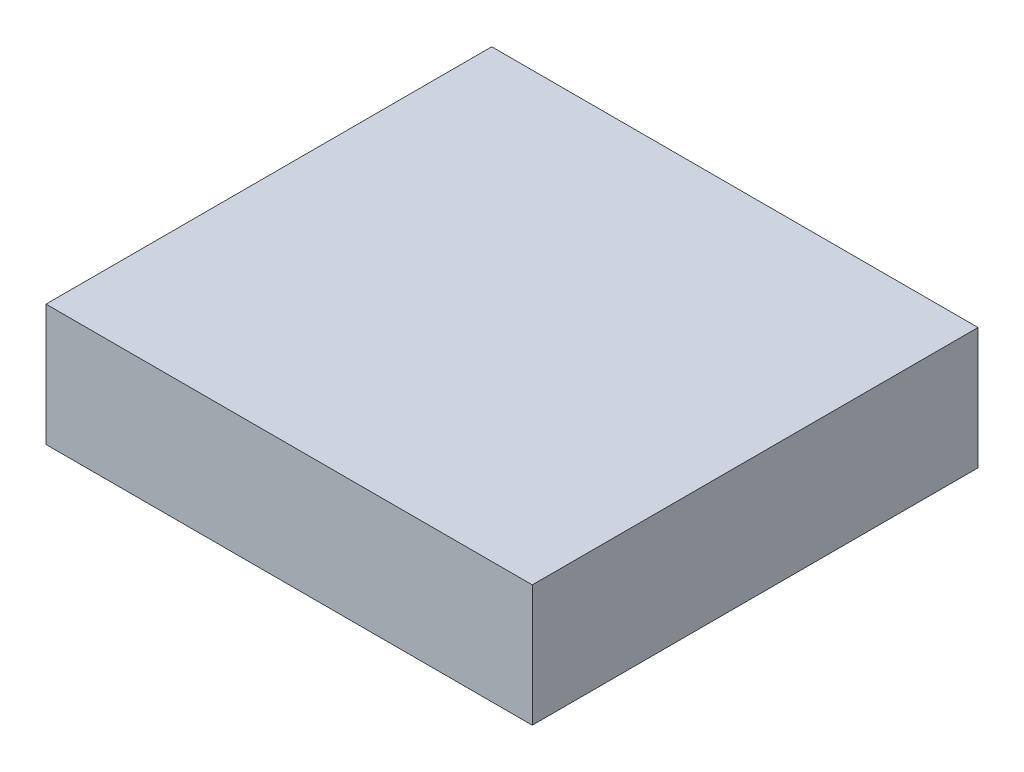
ISO-10303-21;
HEADER;
FILE_DESCRIPTION(('STEP AP214'),'2;1');
FILE_NAME('part.step','',(''),(''),'','','');
FILE_SCHEMA(('AUTOMOTIVE_DESIGN { 1 0 10303 214 1 1 1 1 }'));
ENDSEC;
DATA;
#1=APPLICATION_CONTEXT('core data for automotive mechanical design processes');
#2=APPLICATION_PROTOCOL_DEFINITION('international standard','automotive_design',2000,#1);
#3=PRODUCT_CONTEXT('',#1,'mechanical');
#4=PRODUCT('Part','Part','',(#3));
#5=PRODUCT_RELATED_PRODUCT_CATEGORY('part','',(#4));
#6=PRODUCT_DEFINITION_FORMATION('','',#4);
#7=PRODUCT_DEFINITION_CONTEXT('part definition',#1,'design');
#8=PRODUCT_DEFINITION('design','',#6,#7);
#9=PRODUCT_DEFINITION_SHAPE('','',#8);
#10=(LENGTH_UNIT() NAMED_UNIT(*) SI_UNIT(.MILLI.,.METRE.));
#11=(NAMED_UNIT(*) PLANE_ANGLE_UNIT() SI_UNIT($,.RADIAN.));
#12=(NAMED_UNIT(*) SI_UNIT($,.STERADIAN.) SOLID_ANGLE_UNIT());
#13=UNCERTAINTY_MEASURE_WITH_UNIT(LENGTH_MEASURE(1.E-05),#10,'distance_accuracy_value','');
#14=(GEOMETRIC_REPRESENTATION_CONTEXT(3) GLOBAL_UNCERTAINTY_ASSIGNED_CONTEXT((#13)) GLOBAL_UNIT_ASSIGNED_CONTEXT((#10,
#11,#12)) REPRESENTATION_CONTEXT('',''));
#15=CARTESIAN_POINT('',(0.,0.,0.));
#16=DIRECTION('',(0.,0.,1.));
#17=DIRECTION('',(1.,0.,0.));
#18=AXIS2_PLACEMENT_3D('',#15,#16,#17);
#19=CARTESIAN_POINT('',(-76.2,38.1,-69.85));
#20=DIRECTION('',(1.,0.,0.));
#21=DIRECTION('',(0.,0.,-1.));
#22=AXIS2_PLACEMENT_3D('',#19,#20,#21);
#23=PLANE('',#22);
#24=DIRECTION('',(0.,0.,1.));
#25=VECTOR('',#24,1.);
#26=CARTESIAN_POINT('',(-76.2,0.,-69.85));
#27=LINE('',#26,#25);
#28=CARTESIAN_POINT('',(-76.2,0.,-69.85));
#29=VERTEX_POINT('',#28);
#30=CARTESIAN_POINT('',(-76.2,0.,69.85));
#31=VERTEX_POINT('',#30);
#32=EDGE_CURVE('E97',#29,#31,#27,.T.);
#33=ORIENTED_EDGE('',*,*,#32,.T.);
#34=DIRECTION('',(0.,-1.,0.));
#35=VECTOR('',#34,1.);
#36=CARTESIAN_POINT('',(-76.2,38.1,69.85));
#37=LINE('',#36,#35);
#38=CARTESIAN_POINT('',(-76.2,38.1,69.85));
#39=VERTEX_POINT('',#38);
#40=EDGE_CURVE('E11',#39,#31,#37,.T.);
#41=ORIENTED_EDGE('',*,*,#40,.F.);
#42=DIRECTION('',(0.,0.,1.));
#43=VECTOR('',#42,1.);
#44=CARTESIAN_POINT('',(-76.2,38.1,-69.85));
#45=LINE('',#44,#43);
#46=CARTESIAN_POINT('',(-76.2,38.1,-69.85));
#47=VERTEX_POINT('',#46);
#48=EDGE_CURVE('E85',#47,#39,#45,.T.);
#49=ORIENTED_EDGE('',*,*,#48,.F.);
#50=DIRECTION('',(0.,-1.,0.));
#51=VECTOR('',#50,1.);
#52=CARTESIAN_POINT('',(-76.2,38.1,-69.85));
#53=LINE('',#52,#51);
#54=EDGE_CURVE('E93',#47,#29,#53,.T.);
#55=ORIENTED_EDGE('',*,*,#54,.T.);
#56=EDGE_LOOP('',(#33,#41,#49,#55));
#57=FACE_BOUND('',#56,.T.);
#58=ADVANCED_FACE('F34',(#57),#23,.F.);
#59=CARTESIAN_POINT('',(-76.2,38.1,69.85));
#60=DIRECTION('',(0.,0.,-1.));
#61=DIRECTION('',(-1.,0.,0.));
#62=AXIS2_PLACEMENT_3D('',#59,#60,#61);
#63=PLANE('',#62);
#64=DIRECTION('',(1.,0.,0.));
#65=VECTOR('',#64,1.);
#66=CARTESIAN_POINT('',(-76.2,0.,69.85));
#67=LINE('',#66,#65);
#68=CARTESIAN_POINT('',(76.2,0.,69.85));
#69=VERTEX_POINT('',#68);
#70=EDGE_CURVE('E89',#31,#69,#67,.T.);
#71=ORIENTED_EDGE('',*,*,#70,.T.);
#72=DIRECTION('',(0.,-1.,0.));
#73=VECTOR('',#72,1.);
#74=CARTESIAN_POINT('',(76.2,38.1,69.85));
#75=LINE('',#74,#73);
#76=CARTESIAN_POINT('',(76.2,38.1,69.85));
#77=VERTEX_POINT('',#76);
#78=EDGE_CURVE('E42',#77,#69,#75,.T.);
#79=ORIENTED_EDGE('',*,*,#78,.F.);
#80=DIRECTION('',(1.,0.,0.));
#81=VECTOR('',#80,1.);
#82=CARTESIAN_POINT('',(-76.2,38.1,69.85));
#83=LINE('',#82,#81);
#84=EDGE_CURVE('E80',#39,#77,#83,.T.);
#85=ORIENTED_EDGE('',*,*,#84,.F.);
#86=ORIENTED_EDGE('',*,*,#40,.T.);
#87=EDGE_LOOP('',(#71,#79,#85,#86));
#88=FACE_BOUND('',#87,.T.);
#89=ADVANCED_FACE('F88',(#88),#63,.F.);
#90=CARTESIAN_POINT('',(76.2,38.1,-69.85));
#91=DIRECTION('',(-1.,0.,0.));
#92=DIRECTION('',(0.,0.,1.));
#93=AXIS2_PLACEMENT_3D('',#90,#91,#92);
#94=PLANE('',#93);
#95=DIRECTION('',(0.,0.,-1.));
#96=VECTOR('',#95,1.);
#97=CARTESIAN_POINT('',(76.2,0.,-69.85));
#98=LINE('',#97,#96);
#99=CARTESIAN_POINT('',(76.2,0.,-69.85));
#100=VERTEX_POINT('',#99);
#101=EDGE_CURVE('E67',#69,#100,#98,.T.);
#102=ORIENTED_EDGE('',*,*,#101,.T.);
#103=DIRECTION('',(0.,-1.,0.));
#104=VECTOR('',#103,1.);
#105=CARTESIAN_POINT('',(76.2,38.1,-69.85));
#106=LINE('',#105,#104);
#107=CARTESIAN_POINT('',(76.2,38.1,-69.85));
#108=VERTEX_POINT('',#107);
#109=EDGE_CURVE('E90',#108,#100,#106,.T.);
#110=ORIENTED_EDGE('',*,*,#109,.F.);
#111=DIRECTION('',(0.,0.,-1.));
#112=VECTOR('',#111,1.);
#113=CARTESIAN_POINT('',(76.2,38.1,-69.85));
#114=LINE('',#113,#112);
#115=EDGE_CURVE('E83',#77,#108,#114,.T.);
#116=ORIENTED_EDGE('',*,*,#115,.F.);
#117=ORIENTED_EDGE('',*,*,#78,.T.);
#118=EDGE_LOOP('',(#102,#110,#116,#117));
#119=FACE_BOUND('',#118,.T.);
#120=ADVANCED_FACE('F91',(#119),#94,.F.);
#121=CARTESIAN_POINT('',(-76.2,38.1,-69.85));
#122=DIRECTION('',(0.,0.,1.));
#123=DIRECTION('',(1.,0.,0.));
#124=AXIS2_PLACEMENT_3D('',#121,#122,#123);
#125=PLANE('',#124);
#126=DIRECTION('',(-1.,0.,0.));
#127=VECTOR('',#126,1.);
#128=CARTESIAN_POINT('',(-76.2,0.,-69.85));
#129=LINE('',#128,#127);
#130=EDGE_CURVE('E73',#100,#29,#129,.T.);
#131=ORIENTED_EDGE('',*,*,#130,.T.);
#132=ORIENTED_EDGE('',*,*,#54,.F.);
#133=DIRECTION('',(-1.,0.,0.));
#134=VECTOR('',#133,1.);
#135=CARTESIAN_POINT('',(-76.2,38.1,-69.85));
#136=LINE('',#135,#134);
#137=EDGE_CURVE('E50',#108,#47,#136,.T.);
#138=ORIENTED_EDGE('',*,*,#137,.F.);
#139=ORIENTED_EDGE('',*,*,#109,.T.);
#140=EDGE_LOOP('',(#131,#132,#138,#139));
#141=FACE_BOUND('',#140,.T.);
#142=ADVANCED_FACE('F104',(#141),#125,.F.);
#143=CARTESIAN_POINT('',(0.,38.1,0.));
#144=DIRECTION('',(0.,1.,0.));
#145=DIRECTION('',(0.,0.,1.));
#146=AXIS2_PLACEMENT_3D('',#143,#144,#145);
#147=PLANE('',#146);
#148=ORIENTED_EDGE('',*,*,#48,.T.);
#149=ORIENTED_EDGE('',*,*,#84,.T.);
#150=ORIENTED_EDGE('',*,*,#115,.T.);
#151=ORIENTED_EDGE('',*,*,#137,.T.);
#152=EDGE_LOOP('',(#148,#149,#150,#151));
#153=FACE_BOUND('',#152,.T.);
#154=ADVANCED_FACE('F81',(#153),#147,.T.);
#155=CARTESIAN_POINT('',(0.,0.,0.));
#156=DIRECTION('',(0.,1.,0.));
#157=DIRECTION('',(0.,0.,1.));
#158=AXIS2_PLACEMENT_3D('',#155,#156,#157);
#159=PLANE('',#158);
#160=ORIENTED_EDGE('',*,*,#32,.F.);
#161=ORIENTED_EDGE('',*,*,#130,.F.);
#162=ORIENTED_EDGE('',*,*,#101,.F.);
#163=ORIENTED_EDGE('',*,*,#70,.F.);
#164=EDGE_LOOP('',(#160,#161,#162,#163));
#165=FACE_BOUND('',#164,.T.);
#166=ADVANCED_FACE('F107',(#165),#159,.F.);
#167=CLOSED_SHELL('',(#58,#89,#120,#142,#154,#166));
#168=MANIFOLD_SOLID_BREP('B2',#167);
#169=ADVANCED_BREP_SHAPE_REPRESENTATION('',(#18,#168),#14);
#170=SHAPE_DEFINITION_REPRESENTATION(#9,#169);
ENDSEC;
END-ISO-10303-21;
